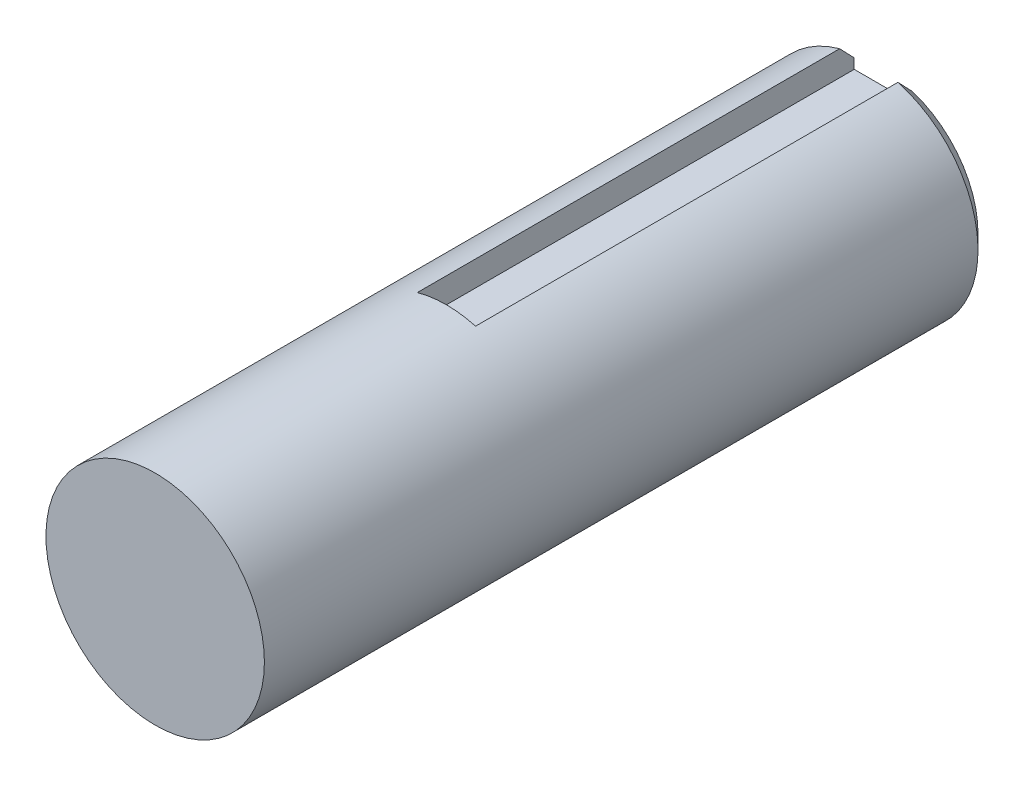
ISO-10303-21;
HEADER;
FILE_DESCRIPTION(('STEP AP214'),'2;1');
FILE_NAME('part.step','',(''),(''),'','','');
FILE_SCHEMA(('AUTOMOTIVE_DESIGN { 1 0 10303 214 1 1 1 1 }'));
ENDSEC;
DATA;
#1=APPLICATION_CONTEXT('core data for automotive mechanical design processes');
#2=APPLICATION_PROTOCOL_DEFINITION('international standard','automotive_design',2000,#1);
#3=PRODUCT_CONTEXT('',#1,'mechanical');
#4=PRODUCT('Part','Part','',(#3));
#5=PRODUCT_RELATED_PRODUCT_CATEGORY('part','',(#4));
#6=PRODUCT_DEFINITION_FORMATION('','',#4);
#7=PRODUCT_DEFINITION_CONTEXT('part definition',#1,'design');
#8=PRODUCT_DEFINITION('design','',#6,#7);
#9=PRODUCT_DEFINITION_SHAPE('','',#8);
#10=(LENGTH_UNIT() NAMED_UNIT(*) SI_UNIT(.MILLI.,.METRE.));
#11=(NAMED_UNIT(*) PLANE_ANGLE_UNIT() SI_UNIT($,.RADIAN.));
#12=(NAMED_UNIT(*) SI_UNIT($,.STERADIAN.) SOLID_ANGLE_UNIT());
#13=UNCERTAINTY_MEASURE_WITH_UNIT(LENGTH_MEASURE(1.E-05),#10,'distance_accuracy_value','');
#14=(GEOMETRIC_REPRESENTATION_CONTEXT(3) GLOBAL_UNCERTAINTY_ASSIGNED_CONTEXT((#13)) GLOBAL_UNIT_ASSIGNED_CONTEXT((#10,
#11,#12)) REPRESENTATION_CONTEXT('',''));
#15=CARTESIAN_POINT('',(0.,0.,0.));
#16=DIRECTION('',(0.,0.,1.));
#17=DIRECTION('',(1.,0.,0.));
#18=AXIS2_PLACEMENT_3D('',#15,#16,#17);
#19=CARTESIAN_POINT('',(0.,0.,100.));
#20=DIRECTION('',(0.,0.,-1.));
#21=DIRECTION('',(-1.,0.,0.));
#22=AXIS2_PLACEMENT_3D('',#19,#20,#21);
#23=CYLINDRICAL_SURFACE('',#22,15.);
#24=CARTESIAN_POINT('',(0.,0.,2.00000000000002));
#25=DIRECTION('',(0.,0.,1.));
#26=DIRECTION('',(1.,0.,0.));
#27=AXIS2_PLACEMENT_3D('',#24,#25,#26);
#28=CIRCLE('',#27,15.);
#29=CARTESIAN_POINT('',(-4.,14.456832294801,2.00000000000002));
#30=VERTEX_POINT('',#29);
#31=CARTESIAN_POINT('',(4.00000000000002,14.456832294801,2.00000000000002));
#32=VERTEX_POINT('',#31);
#33=EDGE_CURVE('E122',#30,#32,#28,.T.);
#34=ORIENTED_EDGE('',*,*,#33,.T.);
#35=DIRECTION('',(0.,0.,-1.));
#36=VECTOR('',#35,1.);
#37=CARTESIAN_POINT('',(4.00000000000002,14.456832294801,100.));
#38=LINE('',#37,#36);
#39=CARTESIAN_POINT('',(4.00000000000002,14.456832294801,60.));
#40=VERTEX_POINT('',#39);
#41=EDGE_CURVE('E111',#32,#40,#38,.F.);
#42=ORIENTED_EDGE('',*,*,#41,.T.);
#43=CARTESIAN_POINT('',(0.,0.,60.));
#44=DIRECTION('',(0.,0.,1.));
#45=DIRECTION('',(1.,0.,0.));
#46=AXIS2_PLACEMENT_3D('',#43,#44,#45);
#47=CIRCLE('',#46,15.);
#48=CARTESIAN_POINT('',(-3.99999999999999,14.456832294801,60.));
#49=VERTEX_POINT('',#48);
#50=EDGE_CURVE('E170',#40,#49,#47,.T.);
#51=ORIENTED_EDGE('',*,*,#50,.T.);
#52=DIRECTION('',(0.,0.,-1.));
#53=VECTOR('',#52,1.);
#54=CARTESIAN_POINT('',(-3.99999999999999,14.456832294801,100.));
#55=LINE('',#54,#53);
#56=EDGE_CURVE('E116',#49,#30,#55,.T.);
#57=ORIENTED_EDGE('',*,*,#56,.T.);
#58=EDGE_LOOP('',(#34,#42,#51,#57));
#59=FACE_BOUND('',#58,.T.);
#60=CARTESIAN_POINT('',(0.,0.,100.));
#61=DIRECTION('',(0.,0.,1.));
#62=DIRECTION('',(1.,0.,0.));
#63=AXIS2_PLACEMENT_3D('',#60,#61,#62);
#64=CIRCLE('',#63,15.);
#65=CARTESIAN_POINT('',(15.,0.,100.));
#66=VERTEX_POINT('',#65);
#67=EDGE_CURVE('E119',#66,#66,#64,.T.);
#68=ORIENTED_EDGE('',*,*,#67,.F.);
#69=EDGE_LOOP('',(#68));
#70=FACE_BOUND('',#69,.T.);
#71=ADVANCED_FACE('F32',(#59,#70),#23,.T.);
#72=CARTESIAN_POINT('',(0.,0.,100.));
#73=DIRECTION('',(0.,0.,1.));
#74=DIRECTION('',(1.,0.,0.));
#75=AXIS2_PLACEMENT_3D('',#72,#73,#74);
#76=PLANE('',#75);
#77=ORIENTED_EDGE('',*,*,#67,.T.);
#78=EDGE_LOOP('',(#77));
#79=FACE_BOUND('',#78,.T.);
#80=ADVANCED_FACE('F154',(#79),#76,.T.);
#81=CARTESIAN_POINT('',(0.,0.,0.));
#82=DIRECTION('',(0.,0.,1.));
#83=DIRECTION('',(1.,0.,0.));
#84=AXIS2_PLACEMENT_3D('',#81,#82,#83);
#85=PLANE('',#84);
#86=CARTESIAN_POINT('',(0.,0.,0.));
#87=DIRECTION('',(0.,0.,1.));
#88=DIRECTION('',(1.,0.,0.));
#89=AXIS2_PLACEMENT_3D('',#86,#87,#88);
#90=CIRCLE('',#89,13.);
#91=CARTESIAN_POINT('',(4.00000000000002,12.3693168768529,0.));
#92=VERTEX_POINT('',#91);
#93=CARTESIAN_POINT('',(-4.,12.369316876853,0.));
#94=VERTEX_POINT('',#93);
#95=EDGE_CURVE('E125',#92,#94,#90,.F.);
#96=ORIENTED_EDGE('',*,*,#95,.T.);
#97=DIRECTION('',(0.,1.,0.));
#98=VECTOR('',#97,1.);
#99=CARTESIAN_POINT('',(-4.,11.,0.));
#100=LINE('',#99,#98);
#101=CARTESIAN_POINT('',(-4.,11.,0.));
#102=VERTEX_POINT('',#101);
#103=EDGE_CURVE('E102',#102,#94,#100,.T.);
#104=ORIENTED_EDGE('',*,*,#103,.F.);
#105=DIRECTION('',(-1.,0.,0.));
#106=VECTOR('',#105,1.);
#107=CARTESIAN_POINT('',(-4.,11.,0.));
#108=LINE('',#107,#106);
#109=CARTESIAN_POINT('',(4.00000000000002,11.,0.));
#110=VERTEX_POINT('',#109);
#111=EDGE_CURVE('E88',#110,#102,#108,.T.);
#112=ORIENTED_EDGE('',*,*,#111,.F.);
#113=DIRECTION('',(0.,1.,0.));
#114=VECTOR('',#113,1.);
#115=CARTESIAN_POINT('',(4.00000000000002,11.,0.));
#116=LINE('',#115,#114);
#117=EDGE_CURVE('E95',#110,#92,#116,.T.);
#118=ORIENTED_EDGE('',*,*,#117,.T.);
#119=EDGE_LOOP('',(#96,#104,#112,#118));
#120=FACE_BOUND('',#119,.T.);
#121=ADVANCED_FACE('F105',(#120),#85,.F.);
#122=CARTESIAN_POINT('',(0.,0.,2.00000000000002));
#123=DIRECTION('',(0.,0.,1.));
#124=DIRECTION('',(1.,0.,0.));
#125=AXIS2_PLACEMENT_3D('',#122,#123,#124);
#126=CONICAL_SURFACE('',#125,15.,0.785398163397451);
#127=CARTESIAN_POINT('',(-4.,6.12499711035196,-5.68456497521708));
#128=CARTESIAN_POINT('',(-4.,6.26696933324007,-5.56568473492292));
#129=CARTESIAN_POINT('',(-4.,6.40834265321393,-5.44609366580801));
#130=CARTESIAN_POINT('',(-4.,6.69004306616586,-5.20569117887402));
#131=CARTESIAN_POINT('',(-4.,6.83037018169555,-5.08487978749274));
#132=CARTESIAN_POINT('',(-4.,7.24999559719709,-4.72092939332521));
#133=CARTESIAN_POINT('',(-4.,7.52796140651744,-4.47625443406412));
#134=CARTESIAN_POINT('',(-4.,8.08115542186154,-3.98394715937353));
#135=CARTESIAN_POINT('',(-4.,8.35638415612143,-3.73631543570864));
#136=CARTESIAN_POINT('',(-4.,8.90477519688596,-3.23876348167889));
#137=CARTESIAN_POINT('',(-4.,9.17793745308017,-2.98884319592208));
#138=CARTESIAN_POINT('',(-4.,9.72255419236916,-2.48730276943205));
#139=CARTESIAN_POINT('',(-4.,9.99400913099237,-2.23568312279433));
#140=CARTESIAN_POINT('',(-4.,10.5356079661438,-1.7310425369209));
#141=CARTESIAN_POINT('',(-4.,10.8057518738595,-1.47802160968242));
#142=CARTESIAN_POINT('',(-4.,11.6146349713889,-0.717248836857887));
#143=CARTESIAN_POINT('',(-4.,12.1517934263639,-0.20781670068568));
#144=CARTESIAN_POINT('',(-4.,13.2230678219691,0.813898397389706));
#145=CARTESIAN_POINT('',(-4.,13.7571846549535,1.3261804256506));
#146=CARTESIAN_POINT('',(-4.,14.8233397022138,2.35287570019732));
#147=CARTESIAN_POINT('',(-4.,15.3553779671672,2.86728889388531));
#148=CARTESIAN_POINT('',(-4.,16.4180551391007,3.89780001692691));
#149=CARTESIAN_POINT('',(-4.,16.9486936985119,4.41389830441633));
#150=CARTESIAN_POINT('',(-4.,18.0088027441558,5.44731413401622));
#151=CARTESIAN_POINT('',(-4.,18.5382732073407,5.964631699775));
#152=CARTESIAN_POINT('',(-4.,19.0673259488422,6.48237456880935));
#153=B_SPLINE_CURVE_WITH_KNOTS('',3,(#127,#128,#129,#130,#131,#132,#133,#134,#135,#136,#137,
#138,#139,#140,#141,#142,#143,#144,#145,#146,#147,#148,#149,#150,#151,#152),.UNSPECIFIED.,.F.,
.F.,(4,2,2,2,2,2,2,2,2,2,2,2,4),(0.,0.555509007716945,1.11100600624741,2.2219080852806,
3.33259143671186,4.44330174235481,5.55370192918971,6.66409262384343,8.8850052261481,
11.1052286934187,13.3253976874903,15.5460740397684,17.7667938232073),.UNSPECIFIED.);
#154=EDGE_CURVE('E133',#94,#30,#153,.T.);
#155=ORIENTED_EDGE('',*,*,#154,.F.);
#156=ORIENTED_EDGE('',*,*,#95,.F.);
#157=CARTESIAN_POINT('',(4.00000000000002,19.0673259488422,6.48237456880935));
#158=CARTESIAN_POINT('',(4.00000000000002,18.5382732073407,5.964631699775));
#159=CARTESIAN_POINT('',(4.00000000000002,18.0088027441558,5.44731413401622));
#160=CARTESIAN_POINT('',(4.00000000000002,16.9486936985119,4.41389830441633));
#161=CARTESIAN_POINT('',(4.00000000000002,16.4180551391007,3.89780001692691));
#162=CARTESIAN_POINT('',(4.00000000000002,15.3553779671672,2.86728889388531));
#163=CARTESIAN_POINT('',(4.00000000000002,14.8233397022138,2.35287570019732));
#164=CARTESIAN_POINT('',(4.00000000000002,13.7571846549535,1.3261804256506));
#165=CARTESIAN_POINT('',(4.00000000000002,13.2230678219691,0.813898397389702));
#166=CARTESIAN_POINT('',(4.00000000000002,12.1517934263639,-0.207816700685685));
#167=CARTESIAN_POINT('',(4.00000000000002,11.6146349713889,-0.717248836857889));
#168=CARTESIAN_POINT('',(4.00000000000002,10.8057518738595,-1.47802160968242));
#169=CARTESIAN_POINT('',(4.00000000000002,10.5356079661438,-1.7310425369209));
#170=CARTESIAN_POINT('',(4.00000000000002,9.99400913099237,-2.23568312279433));
#171=CARTESIAN_POINT('',(4.00000000000002,9.72255419236916,-2.48730276943204));
#172=CARTESIAN_POINT('',(4.00000000000002,9.17793745308017,-2.98884319592208));
#173=CARTESIAN_POINT('',(4.00000000000002,8.90477519688596,-3.23876348167889));
#174=CARTESIAN_POINT('',(4.00000000000002,8.35638415612143,-3.73631543570864));
#175=CARTESIAN_POINT('',(4.00000000000002,8.08115542186154,-3.98394715937353));
#176=CARTESIAN_POINT('',(4.00000000000002,7.52796140651743,-4.47625443406412));
#177=CARTESIAN_POINT('',(4.00000000000002,7.24999559719708,-4.72092939332521));
#178=CARTESIAN_POINT('',(4.00000000000002,6.83037018169555,-5.08487978749274));
#179=CARTESIAN_POINT('',(4.00000000000002,6.69004306616585,-5.20569117887402));
#180=CARTESIAN_POINT('',(4.00000000000002,6.40834265321392,-5.44609366580801));
#181=CARTESIAN_POINT('',(4.00000000000002,6.26696933324006,-5.56568473492291));
#182=CARTESIAN_POINT('',(4.00000000000002,6.12499711035195,-5.68456497521707));
#183=B_SPLINE_CURVE_WITH_KNOTS('',3,(#157,#158,#159,#160,#161,#162,#163,#164,#165,#166,#167,
#168,#169,#170,#171,#172,#173,#174,#175,#176,#177,#178,#179,#180,#181,#182),.UNSPECIFIED.,.F.,
.F.,(4,2,2,2,2,2,2,2,2,2,2,2,4),(0.,2.22071978343893,4.44139613571702,6.66156512978862,
8.88178859705924,11.1027011993639,12.2130918940176,13.3234920808525,14.4342023864955,
15.5448857379267,16.6557878169599,17.2112848154904,17.7667938232073),.UNSPECIFIED.);
#184=EDGE_CURVE('E98',#32,#92,#183,.T.);
#185=ORIENTED_EDGE('',*,*,#184,.F.);
#186=ORIENTED_EDGE('',*,*,#33,.F.);
#187=EDGE_LOOP('',(#155,#156,#185,#186));
#188=FACE_BOUND('',#187,.T.);
#189=ADVANCED_FACE('F140',(#188),#126,.T.);
#190=CARTESIAN_POINT('',(-3.99999999999999,11.,60.));
#191=DIRECTION('',(0.,0.,1.));
#192=DIRECTION('',(1.,0.,0.));
#193=AXIS2_PLACEMENT_3D('',#190,#191,#192);
#194=PLANE('',#193);
#195=DIRECTION('',(0.,1.,0.));
#196=VECTOR('',#195,1.);
#197=CARTESIAN_POINT('',(4.00000000000002,11.,60.));
#198=LINE('',#197,#196);
#199=CARTESIAN_POINT('',(4.00000000000002,14.,60.));
#200=VERTEX_POINT('',#199);
#201=EDGE_CURVE('E103',#200,#40,#198,.T.);
#202=ORIENTED_EDGE('',*,*,#201,.F.);
#203=DIRECTION('',(1.,0.,0.));
#204=VECTOR('',#203,1.);
#205=CARTESIAN_POINT('',(-3.99999999999999,14.,60.));
#206=LINE('',#205,#204);
#207=CARTESIAN_POINT('',(-3.99999999999999,14.,60.));
#208=VERTEX_POINT('',#207);
#209=EDGE_CURVE('E40',#200,#208,#206,.F.);
#210=ORIENTED_EDGE('',*,*,#209,.T.);
#211=DIRECTION('',(0.,1.,0.));
#212=VECTOR('',#211,1.);
#213=CARTESIAN_POINT('',(-3.99999999999999,11.,60.));
#214=LINE('',#213,#212);
#215=EDGE_CURVE('E106',#208,#49,#214,.T.);
#216=ORIENTED_EDGE('',*,*,#215,.T.);
#217=ORIENTED_EDGE('',*,*,#50,.F.);
#218=EDGE_LOOP('',(#202,#210,#216,#217));
#219=FACE_BOUND('',#218,.T.);
#220=ADVANCED_FACE('F148',(#219),#194,.F.);
#221=CARTESIAN_POINT('',(-4.,11.,0.));
#222=DIRECTION('',(-1.,0.,0.));
#223=DIRECTION('',(0.,0.,1.));
#224=AXIS2_PLACEMENT_3D('',#221,#222,#223);
#225=PLANE('',#224);
#226=ORIENTED_EDGE('',*,*,#215,.F.);
#227=CARTESIAN_POINT('',(-3.99999999999999,14.,57.));
#228=DIRECTION('',(-1.,0.,0.));
#229=DIRECTION('',(0.,0.,1.));
#230=AXIS2_PLACEMENT_3D('',#227,#228,#229);
#231=CIRCLE('',#230,3.);
#232=CARTESIAN_POINT('',(-3.99999999999999,11.,57.));
#233=VERTEX_POINT('',#232);
#234=EDGE_CURVE('E11',#208,#233,#231,.F.);
#235=ORIENTED_EDGE('',*,*,#234,.T.);
#236=DIRECTION('',(0.,0.,1.));
#237=VECTOR('',#236,1.);
#238=CARTESIAN_POINT('',(-4.,11.,0.));
#239=LINE('',#238,#237);
#240=EDGE_CURVE('E92',#102,#233,#239,.T.);
#241=ORIENTED_EDGE('',*,*,#240,.F.);
#242=ORIENTED_EDGE('',*,*,#103,.T.);
#243=ORIENTED_EDGE('',*,*,#154,.T.);
#244=ORIENTED_EDGE('',*,*,#56,.F.);
#245=EDGE_LOOP('',(#226,#235,#241,#242,#243,#244));
#246=FACE_BOUND('',#245,.T.);
#247=ADVANCED_FACE('F147',(#246),#225,.F.);
#248=CARTESIAN_POINT('',(4.00000000000002,11.,0.));
#249=DIRECTION('',(1.,0.,0.));
#250=DIRECTION('',(0.,0.,-1.));
#251=AXIS2_PLACEMENT_3D('',#248,#249,#250);
#252=PLANE('',#251);
#253=DIRECTION('',(0.,0.,-1.));
#254=VECTOR('',#253,1.);
#255=CARTESIAN_POINT('',(4.00000000000002,11.,0.));
#256=LINE('',#255,#254);
#257=CARTESIAN_POINT('',(4.00000000000002,11.,57.));
#258=VERTEX_POINT('',#257);
#259=EDGE_CURVE('E83',#258,#110,#256,.T.);
#260=ORIENTED_EDGE('',*,*,#259,.F.);
#261=CARTESIAN_POINT('',(4.00000000000002,14.,57.));
#262=DIRECTION('',(1.,0.,0.));
#263=DIRECTION('',(0.,0.,-1.));
#264=AXIS2_PLACEMENT_3D('',#261,#262,#263);
#265=CIRCLE('',#264,3.);
#266=EDGE_CURVE('E54',#258,#200,#265,.F.);
#267=ORIENTED_EDGE('',*,*,#266,.T.);
#268=ORIENTED_EDGE('',*,*,#201,.T.);
#269=ORIENTED_EDGE('',*,*,#41,.F.);
#270=ORIENTED_EDGE('',*,*,#184,.T.);
#271=ORIENTED_EDGE('',*,*,#117,.F.);
#272=EDGE_LOOP('',(#260,#267,#268,#269,#270,#271));
#273=FACE_BOUND('',#272,.T.);
#274=ADVANCED_FACE('F96',(#273),#252,.F.);
#275=CARTESIAN_POINT('',(0.,11.,0.));
#276=DIRECTION('',(0.,1.,0.));
#277=DIRECTION('',(0.,0.,1.));
#278=AXIS2_PLACEMENT_3D('',#275,#276,#277);
#279=PLANE('',#278);
#280=ORIENTED_EDGE('',*,*,#240,.T.);
#281=DIRECTION('',(1.,0.,0.));
#282=VECTOR('',#281,1.);
#283=CARTESIAN_POINT('',(0.,11.,57.));
#284=LINE('',#283,#282);
#285=EDGE_CURVE('E91',#233,#258,#284,.T.);
#286=ORIENTED_EDGE('',*,*,#285,.T.);
#287=ORIENTED_EDGE('',*,*,#259,.T.);
#288=ORIENTED_EDGE('',*,*,#111,.T.);
#289=EDGE_LOOP('',(#280,#286,#287,#288));
#290=FACE_BOUND('',#289,.T.);
#291=ADVANCED_FACE('F86',(#290),#279,.T.);
#292=CARTESIAN_POINT('',(0.,14.,57.));
#293=DIRECTION('',(1.,0.,0.));
#294=DIRECTION('',(0.,0.,-1.));
#295=AXIS2_PLACEMENT_3D('',#292,#293,#294);
#296=CYLINDRICAL_SURFACE('',#295,3.);
#297=ORIENTED_EDGE('',*,*,#234,.F.);
#298=ORIENTED_EDGE('',*,*,#209,.F.);
#299=ORIENTED_EDGE('',*,*,#266,.F.);
#300=ORIENTED_EDGE('',*,*,#285,.F.);
#301=EDGE_LOOP('',(#297,#298,#299,#300));
#302=FACE_BOUND('',#301,.T.);
#303=ADVANCED_FACE('F34',(#302),#296,.F.);
#304=CLOSED_SHELL('',(#71,#80,#121,#189,#220,#247,#274,#291,#303));
#305=MANIFOLD_SOLID_BREP('B2',#304);
#306=ADVANCED_BREP_SHAPE_REPRESENTATION('',(#18,#305),#14);
#307=SHAPE_DEFINITION_REPRESENTATION(#9,#306);
ENDSEC;
END-ISO-10303-21;
